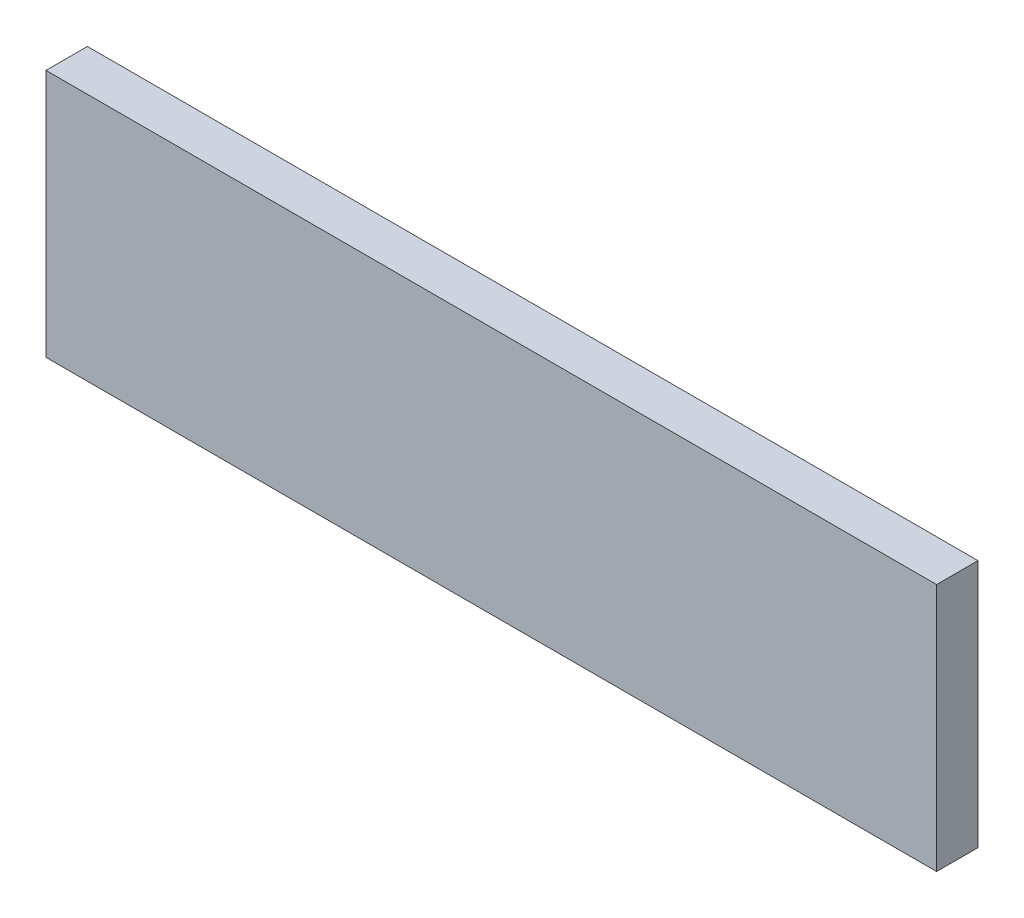
ISO-10303-21;
HEADER;
FILE_DESCRIPTION(('STEP AP214'),'2;1');
FILE_NAME('part.step','',(''),(''),'','','');
FILE_SCHEMA(('AUTOMOTIVE_DESIGN { 1 0 10303 214 1 1 1 1 }'));
ENDSEC;
DATA;
#1=APPLICATION_CONTEXT('core data for automotive mechanical design processes');
#2=APPLICATION_PROTOCOL_DEFINITION('international standard','automotive_design',2000,#1);
#3=PRODUCT_CONTEXT('',#1,'mechanical');
#4=PRODUCT('Part','Part','',(#3));
#5=PRODUCT_RELATED_PRODUCT_CATEGORY('part','',(#4));
#6=PRODUCT_DEFINITION_FORMATION('','',#4);
#7=PRODUCT_DEFINITION_CONTEXT('part definition',#1,'design');
#8=PRODUCT_DEFINITION('design','',#6,#7);
#9=PRODUCT_DEFINITION_SHAPE('','',#8);
#10=(LENGTH_UNIT() NAMED_UNIT(*) SI_UNIT(.MILLI.,.METRE.));
#11=(NAMED_UNIT(*) PLANE_ANGLE_UNIT() SI_UNIT($,.RADIAN.));
#12=(NAMED_UNIT(*) SI_UNIT($,.STERADIAN.) SOLID_ANGLE_UNIT());
#13=UNCERTAINTY_MEASURE_WITH_UNIT(LENGTH_MEASURE(1.E-05),#10,'distance_accuracy_value','');
#14=(GEOMETRIC_REPRESENTATION_CONTEXT(3) GLOBAL_UNCERTAINTY_ASSIGNED_CONTEXT((#13)) GLOBAL_UNIT_ASSIGNED_CONTEXT((#10,
#11,#12)) REPRESENTATION_CONTEXT('',''));
#15=CARTESIAN_POINT('',(0.,0.,0.));
#16=DIRECTION('',(0.,0.,1.));
#17=DIRECTION('',(1.,0.,0.));
#18=AXIS2_PLACEMENT_3D('',#15,#16,#17);
#19=CARTESIAN_POINT('',(1092.2,0.,0.));
#20=DIRECTION('',(0.,0.,-1.));
#21=DIRECTION('',(-1.,0.,0.));
#22=AXIS2_PLACEMENT_3D('',#19,#20,#21);
#23=PLANE('',#22);
#24=DIRECTION('',(0.,-1.,0.));
#25=VECTOR('',#24,1.);
#26=CARTESIAN_POINT('',(0.,0.,0.));
#27=LINE('',#26,#25);
#28=CARTESIAN_POINT('',(0.,304.8,0.));
#29=VERTEX_POINT('',#28);
#30=CARTESIAN_POINT('',(0.,0.,0.));
#31=VERTEX_POINT('',#30);
#32=EDGE_CURVE('E95',#29,#31,#27,.T.);
#33=ORIENTED_EDGE('',*,*,#32,.T.);
#34=DIRECTION('',(-1.,0.,0.));
#35=VECTOR('',#34,1.);
#36=CARTESIAN_POINT('',(1092.2,0.,0.));
#37=LINE('',#36,#35);
#38=CARTESIAN_POINT('',(1092.2,0.,0.));
#39=VERTEX_POINT('',#38);
#40=EDGE_CURVE('E11',#39,#31,#37,.T.);
#41=ORIENTED_EDGE('',*,*,#40,.F.);
#42=DIRECTION('',(0.,-1.,0.));
#43=VECTOR('',#42,1.);
#44=CARTESIAN_POINT('',(1092.2,0.,0.));
#45=LINE('',#44,#43);
#46=CARTESIAN_POINT('',(1092.2,304.8,0.));
#47=VERTEX_POINT('',#46);
#48=EDGE_CURVE('E83',#47,#39,#45,.T.);
#49=ORIENTED_EDGE('',*,*,#48,.F.);
#50=DIRECTION('',(-1.,0.,0.));
#51=VECTOR('',#50,1.);
#52=CARTESIAN_POINT('',(1092.2,304.8,0.));
#53=LINE('',#52,#51);
#54=EDGE_CURVE('E91',#47,#29,#53,.T.);
#55=ORIENTED_EDGE('',*,*,#54,.T.);
#56=EDGE_LOOP('',(#33,#41,#49,#55));
#57=FACE_BOUND('',#56,.T.);
#58=ADVANCED_FACE('F32',(#57),#23,.F.);
#59=CARTESIAN_POINT('',(1092.2,0.,0.));
#60=DIRECTION('',(0.,1.,0.));
#61=DIRECTION('',(0.,0.,1.));
#62=AXIS2_PLACEMENT_3D('',#59,#60,#61);
#63=PLANE('',#62);
#64=DIRECTION('',(0.,0.,-1.));
#65=VECTOR('',#64,1.);
#66=CARTESIAN_POINT('',(0.,0.,0.));
#67=LINE('',#66,#65);
#68=CARTESIAN_POINT('',(0.,0.,-50.8));
#69=VERTEX_POINT('',#68);
#70=EDGE_CURVE('E87',#31,#69,#67,.T.);
#71=ORIENTED_EDGE('',*,*,#70,.T.);
#72=DIRECTION('',(-1.,0.,0.));
#73=VECTOR('',#72,1.);
#74=CARTESIAN_POINT('',(1092.2,0.,-50.8));
#75=LINE('',#74,#73);
#76=CARTESIAN_POINT('',(1092.2,0.,-50.8));
#77=VERTEX_POINT('',#76);
#78=EDGE_CURVE('E40',#77,#69,#75,.T.);
#79=ORIENTED_EDGE('',*,*,#78,.F.);
#80=DIRECTION('',(0.,0.,-1.));
#81=VECTOR('',#80,1.);
#82=CARTESIAN_POINT('',(1092.2,0.,0.));
#83=LINE('',#82,#81);
#84=EDGE_CURVE('E78',#39,#77,#83,.T.);
#85=ORIENTED_EDGE('',*,*,#84,.F.);
#86=ORIENTED_EDGE('',*,*,#40,.T.);
#87=EDGE_LOOP('',(#71,#79,#85,#86));
#88=FACE_BOUND('',#87,.T.);
#89=ADVANCED_FACE('F86',(#88),#63,.F.);
#90=CARTESIAN_POINT('',(1092.2,0.,-50.8));
#91=DIRECTION('',(0.,0.,1.));
#92=DIRECTION('',(1.,0.,0.));
#93=AXIS2_PLACEMENT_3D('',#90,#91,#92);
#94=PLANE('',#93);
#95=DIRECTION('',(0.,1.,0.));
#96=VECTOR('',#95,1.);
#97=CARTESIAN_POINT('',(0.,0.,-50.8));
#98=LINE('',#97,#96);
#99=CARTESIAN_POINT('',(0.,304.8,-50.8));
#100=VERTEX_POINT('',#99);
#101=EDGE_CURVE('E65',#69,#100,#98,.T.);
#102=ORIENTED_EDGE('',*,*,#101,.T.);
#103=DIRECTION('',(-1.,0.,0.));
#104=VECTOR('',#103,1.);
#105=CARTESIAN_POINT('',(1092.2,304.8,-50.8));
#106=LINE('',#105,#104);
#107=CARTESIAN_POINT('',(1092.2,304.8,-50.8));
#108=VERTEX_POINT('',#107);
#109=EDGE_CURVE('E88',#108,#100,#106,.T.);
#110=ORIENTED_EDGE('',*,*,#109,.F.);
#111=DIRECTION('',(0.,1.,0.));
#112=VECTOR('',#111,1.);
#113=CARTESIAN_POINT('',(1092.2,0.,-50.8));
#114=LINE('',#113,#112);
#115=EDGE_CURVE('E81',#77,#108,#114,.T.);
#116=ORIENTED_EDGE('',*,*,#115,.F.);
#117=ORIENTED_EDGE('',*,*,#78,.T.);
#118=EDGE_LOOP('',(#102,#110,#116,#117));
#119=FACE_BOUND('',#118,.T.);
#120=ADVANCED_FACE('F89',(#119),#94,.F.);
#121=CARTESIAN_POINT('',(1092.2,304.8,0.));
#122=DIRECTION('',(0.,-1.,0.));
#123=DIRECTION('',(0.,0.,-1.));
#124=AXIS2_PLACEMENT_3D('',#121,#122,#123);
#125=PLANE('',#124);
#126=DIRECTION('',(0.,0.,1.));
#127=VECTOR('',#126,1.);
#128=CARTESIAN_POINT('',(0.,304.8,0.));
#129=LINE('',#128,#127);
#130=EDGE_CURVE('E71',#100,#29,#129,.T.);
#131=ORIENTED_EDGE('',*,*,#130,.T.);
#132=ORIENTED_EDGE('',*,*,#54,.F.);
#133=DIRECTION('',(0.,0.,1.));
#134=VECTOR('',#133,1.);
#135=CARTESIAN_POINT('',(1092.2,304.8,0.));
#136=LINE('',#135,#134);
#137=EDGE_CURVE('E48',#108,#47,#136,.T.);
#138=ORIENTED_EDGE('',*,*,#137,.F.);
#139=ORIENTED_EDGE('',*,*,#109,.T.);
#140=EDGE_LOOP('',(#131,#132,#138,#139));
#141=FACE_BOUND('',#140,.T.);
#142=ADVANCED_FACE('F102',(#141),#125,.F.);
#143=CARTESIAN_POINT('',(1092.2,0.,0.));
#144=DIRECTION('',(-1.,0.,0.));
#145=DIRECTION('',(0.,0.,1.));
#146=AXIS2_PLACEMENT_3D('',#143,#144,#145);
#147=PLANE('',#146);
#148=ORIENTED_EDGE('',*,*,#48,.T.);
#149=ORIENTED_EDGE('',*,*,#84,.T.);
#150=ORIENTED_EDGE('',*,*,#115,.T.);
#151=ORIENTED_EDGE('',*,*,#137,.T.);
#152=EDGE_LOOP('',(#148,#149,#150,#151));
#153=FACE_BOUND('',#152,.T.);
#154=ADVANCED_FACE('F79',(#153),#147,.F.);
#155=CARTESIAN_POINT('',(0.,0.,0.));
#156=DIRECTION('',(-1.,0.,0.));
#157=DIRECTION('',(0.,0.,1.));
#158=AXIS2_PLACEMENT_3D('',#155,#156,#157);
#159=PLANE('',#158);
#160=ORIENTED_EDGE('',*,*,#32,.F.);
#161=ORIENTED_EDGE('',*,*,#130,.F.);
#162=ORIENTED_EDGE('',*,*,#101,.F.);
#163=ORIENTED_EDGE('',*,*,#70,.F.);
#164=EDGE_LOOP('',(#160,#161,#162,#163));
#165=FACE_BOUND('',#164,.T.);
#166=ADVANCED_FACE('F105',(#165),#159,.T.);
#167=CLOSED_SHELL('',(#58,#89,#120,#142,#154,#166));
#168=MANIFOLD_SOLID_BREP('B2',#167);
#169=ADVANCED_BREP_SHAPE_REPRESENTATION('',(#18,#168),#14);
#170=SHAPE_DEFINITION_REPRESENTATION(#9,#169);
ENDSEC;
END-ISO-10303-21;
